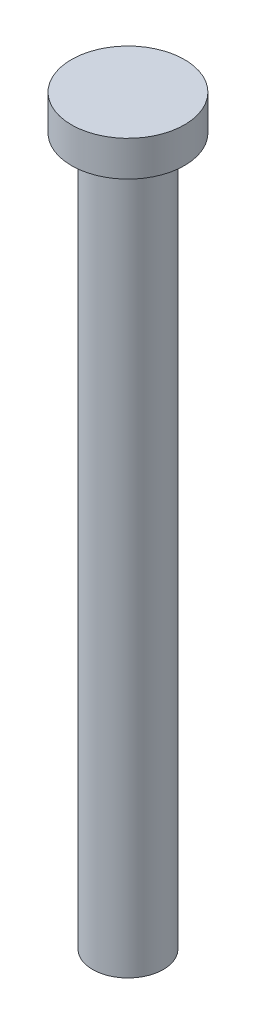
ISO-10303-21;
HEADER;
FILE_DESCRIPTION(('STEP AP214'),'2;1');
FILE_NAME('part.step','',(''),(''),'','','');
FILE_SCHEMA(('AUTOMOTIVE_DESIGN { 1 0 10303 214 1 1 1 1 }'));
ENDSEC;
DATA;
#1=APPLICATION_CONTEXT('core data for automotive mechanical design processes');
#2=APPLICATION_PROTOCOL_DEFINITION('international standard','automotive_design',2000,#1);
#3=PRODUCT_CONTEXT('',#1,'mechanical');
#4=PRODUCT('Part','Part','',(#3));
#5=PRODUCT_RELATED_PRODUCT_CATEGORY('part','',(#4));
#6=PRODUCT_DEFINITION_FORMATION('','',#4);
#7=PRODUCT_DEFINITION_CONTEXT('part definition',#1,'design');
#8=PRODUCT_DEFINITION('design','',#6,#7);
#9=PRODUCT_DEFINITION_SHAPE('','',#8);
#10=(LENGTH_UNIT() NAMED_UNIT(*) SI_UNIT(.MILLI.,.METRE.));
#11=(NAMED_UNIT(*) PLANE_ANGLE_UNIT() SI_UNIT($,.RADIAN.));
#12=(NAMED_UNIT(*) SI_UNIT($,.STERADIAN.) SOLID_ANGLE_UNIT());
#13=UNCERTAINTY_MEASURE_WITH_UNIT(LENGTH_MEASURE(1.E-05),#10,'distance_accuracy_value','');
#14=(GEOMETRIC_REPRESENTATION_CONTEXT(3) GLOBAL_UNCERTAINTY_ASSIGNED_CONTEXT((#13)) GLOBAL_UNIT_ASSIGNED_CONTEXT((#10,
#11,#12)) REPRESENTATION_CONTEXT('',''));
#15=CARTESIAN_POINT('',(0.,0.,0.));
#16=DIRECTION('',(0.,0.,1.));
#17=DIRECTION('',(1.,0.,0.));
#18=AXIS2_PLACEMENT_3D('',#15,#16,#17);
#19=CARTESIAN_POINT('',(0.,-50.,0.));
#20=DIRECTION('',(0.,1.,0.));
#21=DIRECTION('',(0.,0.,1.));
#22=AXIS2_PLACEMENT_3D('',#19,#20,#21);
#23=CYLINDRICAL_SURFACE('',#22,2.5);
#24=CARTESIAN_POINT('',(0.,-50.,0.));
#25=DIRECTION('',(0.,1.,0.));
#26=DIRECTION('',(0.,0.,1.));
#27=AXIS2_PLACEMENT_3D('',#24,#25,#26);
#28=CIRCLE('',#27,2.5);
#29=CARTESIAN_POINT('',(0.,-50.,2.5));
#30=VERTEX_POINT('',#29);
#31=EDGE_CURVE('E10',#30,#30,#28,.T.);
#32=ORIENTED_EDGE('',*,*,#31,.T.);
#33=EDGE_LOOP('',(#32));
#34=FACE_BOUND('',#33,.T.);
#35=CARTESIAN_POINT('',(0.,0.,0.));
#36=DIRECTION('',(0.,1.,0.));
#37=DIRECTION('',(0.,0.,1.));
#38=AXIS2_PLACEMENT_3D('',#35,#36,#37);
#39=CIRCLE('',#38,2.5);
#40=CARTESIAN_POINT('',(0.,0.,2.5));
#41=VERTEX_POINT('',#40);
#42=EDGE_CURVE('E34',#41,#41,#39,.T.);
#43=ORIENTED_EDGE('',*,*,#42,.F.);
#44=EDGE_LOOP('',(#43));
#45=FACE_BOUND('',#44,.T.);
#46=ADVANCED_FACE('F31',(#34,#45),#23,.T.);
#47=CARTESIAN_POINT('',(0.,-50.,0.));
#48=DIRECTION('',(0.,1.,0.));
#49=DIRECTION('',(0.,0.,1.));
#50=AXIS2_PLACEMENT_3D('',#47,#48,#49);
#51=PLANE('',#50);
#52=ORIENTED_EDGE('',*,*,#31,.F.);
#53=EDGE_LOOP('',(#52));
#54=FACE_BOUND('',#53,.T.);
#55=ADVANCED_FACE('F54',(#54),#51,.F.);
#56=CARTESIAN_POINT('',(0.,2.5,0.));
#57=DIRECTION('',(0.,-1.,0.));
#58=DIRECTION('',(0.,0.,-1.));
#59=AXIS2_PLACEMENT_3D('',#56,#57,#58);
#60=CYLINDRICAL_SURFACE('',#59,4.);
#61=CARTESIAN_POINT('',(0.,2.5,0.));
#62=DIRECTION('',(0.,1.,0.));
#63=DIRECTION('',(0.,0.,1.));
#64=AXIS2_PLACEMENT_3D('',#61,#62,#63);
#65=CIRCLE('',#64,4.);
#66=CARTESIAN_POINT('',(0.,2.5,4.));
#67=VERTEX_POINT('',#66);
#68=EDGE_CURVE('E41',#67,#67,#65,.T.);
#69=ORIENTED_EDGE('',*,*,#68,.F.);
#70=EDGE_LOOP('',(#69));
#71=FACE_BOUND('',#70,.T.);
#72=CARTESIAN_POINT('',(0.,0.,0.));
#73=DIRECTION('',(0.,1.,0.));
#74=DIRECTION('',(0.,0.,1.));
#75=AXIS2_PLACEMENT_3D('',#72,#73,#74);
#76=CIRCLE('',#75,4.);
#77=CARTESIAN_POINT('',(0.,0.,4.));
#78=VERTEX_POINT('',#77);
#79=EDGE_CURVE('E43',#78,#78,#76,.T.);
#80=ORIENTED_EDGE('',*,*,#79,.T.);
#81=EDGE_LOOP('',(#80));
#82=FACE_BOUND('',#81,.T.);
#83=ADVANCED_FACE('F51',(#71,#82),#60,.T.);
#84=CARTESIAN_POINT('',(0.,2.5,0.));
#85=DIRECTION('',(0.,1.,0.));
#86=DIRECTION('',(0.,0.,1.));
#87=AXIS2_PLACEMENT_3D('',#84,#85,#86);
#88=PLANE('',#87);
#89=ORIENTED_EDGE('',*,*,#68,.T.);
#90=EDGE_LOOP('',(#89));
#91=FACE_BOUND('',#90,.T.);
#92=ADVANCED_FACE('F49',(#91),#88,.T.);
#93=CARTESIAN_POINT('',(0.,0.,0.));
#94=DIRECTION('',(0.,1.,0.));
#95=DIRECTION('',(0.,0.,1.));
#96=AXIS2_PLACEMENT_3D('',#93,#94,#95);
#97=PLANE('',#96);
#98=ORIENTED_EDGE('',*,*,#42,.T.);
#99=EDGE_LOOP('',(#98));
#100=FACE_BOUND('',#99,.T.);
#101=ORIENTED_EDGE('',*,*,#79,.F.);
#102=EDGE_LOOP('',(#101));
#103=FACE_BOUND('',#102,.T.);
#104=ADVANCED_FACE('F58',(#100,#103),#97,.F.);
#105=CLOSED_SHELL('',(#46,#55,#83,#92,#104));
#106=MANIFOLD_SOLID_BREP('B2',#105);
#107=ADVANCED_BREP_SHAPE_REPRESENTATION('',(#18,#106),#14);
#108=SHAPE_DEFINITION_REPRESENTATION(#9,#107);
ENDSEC;
END-ISO-10303-21;
